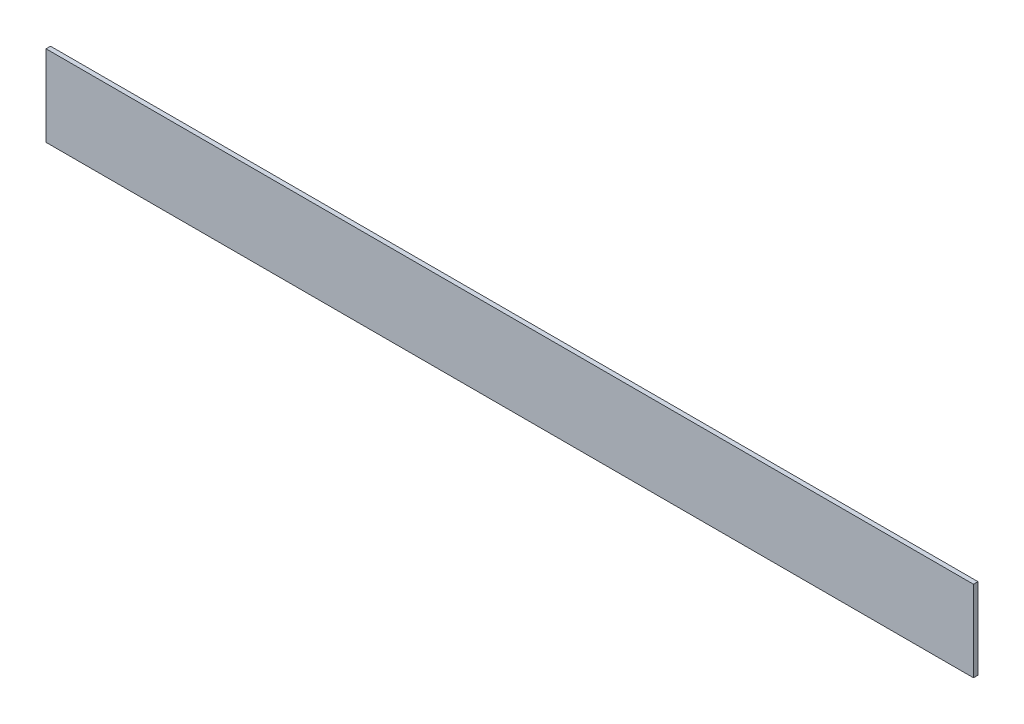
ISO-10303-21;
HEADER;
FILE_DESCRIPTION(('STEP AP214'),'2;1');
FILE_NAME('part.step','',(''),(''),'','','');
FILE_SCHEMA(('AUTOMOTIVE_DESIGN { 1 0 10303 214 1 1 1 1 }'));
ENDSEC;
DATA;
#1=APPLICATION_CONTEXT('core data for automotive mechanical design processes');
#2=APPLICATION_PROTOCOL_DEFINITION('international standard','automotive_design',2000,#1);
#3=PRODUCT_CONTEXT('',#1,'mechanical');
#4=PRODUCT('Part','Part','',(#3));
#5=PRODUCT_RELATED_PRODUCT_CATEGORY('part','',(#4));
#6=PRODUCT_DEFINITION_FORMATION('','',#4);
#7=PRODUCT_DEFINITION_CONTEXT('part definition',#1,'design');
#8=PRODUCT_DEFINITION('design','',#6,#7);
#9=PRODUCT_DEFINITION_SHAPE('','',#8);
#10=(LENGTH_UNIT() NAMED_UNIT(*) SI_UNIT(.MILLI.,.METRE.));
#11=(NAMED_UNIT(*) PLANE_ANGLE_UNIT() SI_UNIT($,.RADIAN.));
#12=(NAMED_UNIT(*) SI_UNIT($,.STERADIAN.) SOLID_ANGLE_UNIT());
#13=UNCERTAINTY_MEASURE_WITH_UNIT(LENGTH_MEASURE(1.E-05),#10,'distance_accuracy_value','');
#14=(GEOMETRIC_REPRESENTATION_CONTEXT(3) GLOBAL_UNCERTAINTY_ASSIGNED_CONTEXT((#13)) GLOBAL_UNIT_ASSIGNED_CONTEXT((#10,
#11,#12)) REPRESENTATION_CONTEXT('',''));
#15=CARTESIAN_POINT('',(0.,0.,0.));
#16=DIRECTION('',(0.,0.,1.));
#17=DIRECTION('',(1.,0.,0.));
#18=AXIS2_PLACEMENT_3D('',#15,#16,#17);
#19=CARTESIAN_POINT('',(-327.025,0.,3.175));
#20=DIRECTION('',(1.,0.,0.));
#21=DIRECTION('',(0.,0.,-1.));
#22=AXIS2_PLACEMENT_3D('',#19,#20,#21);
#23=PLANE('',#22);
#24=DIRECTION('',(0.,-1.,0.));
#25=VECTOR('',#24,1.);
#26=CARTESIAN_POINT('',(-327.025,0.,0.));
#27=LINE('',#26,#25);
#28=CARTESIAN_POINT('',(-327.025,57.15,0.));
#29=VERTEX_POINT('',#28);
#30=CARTESIAN_POINT('',(-327.025,0.,0.));
#31=VERTEX_POINT('',#30);
#32=EDGE_CURVE('E96',#29,#31,#27,.T.);
#33=ORIENTED_EDGE('',*,*,#32,.T.);
#34=DIRECTION('',(0.,0.,-1.));
#35=VECTOR('',#34,1.);
#36=CARTESIAN_POINT('',(-327.025,0.,3.175));
#37=LINE('',#36,#35);
#38=CARTESIAN_POINT('',(-327.025,0.,3.175));
#39=VERTEX_POINT('',#38);
#40=EDGE_CURVE('E11',#39,#31,#37,.T.);
#41=ORIENTED_EDGE('',*,*,#40,.F.);
#42=DIRECTION('',(0.,-1.,0.));
#43=VECTOR('',#42,1.);
#44=CARTESIAN_POINT('',(-327.025,0.,3.175));
#45=LINE('',#44,#43);
#46=CARTESIAN_POINT('',(-327.025,57.15,3.175));
#47=VERTEX_POINT('',#46);
#48=EDGE_CURVE('E84',#47,#39,#45,.T.);
#49=ORIENTED_EDGE('',*,*,#48,.F.);
#50=DIRECTION('',(0.,0.,-1.));
#51=VECTOR('',#50,1.);
#52=CARTESIAN_POINT('',(-327.025,57.15,3.175));
#53=LINE('',#52,#51);
#54=EDGE_CURVE('E92',#47,#29,#53,.T.);
#55=ORIENTED_EDGE('',*,*,#54,.T.);
#56=EDGE_LOOP('',(#33,#41,#49,#55));
#57=FACE_BOUND('',#56,.T.);
#58=ADVANCED_FACE('F33',(#57),#23,.F.);
#59=CARTESIAN_POINT('',(-327.025,0.,3.175));
#60=DIRECTION('',(0.,1.,0.));
#61=DIRECTION('',(0.,0.,1.));
#62=AXIS2_PLACEMENT_3D('',#59,#60,#61);
#63=PLANE('',#62);
#64=DIRECTION('',(1.,0.,0.));
#65=VECTOR('',#64,1.);
#66=CARTESIAN_POINT('',(-327.025,0.,0.));
#67=LINE('',#66,#65);
#68=CARTESIAN_POINT('',(327.025,0.,0.));
#69=VERTEX_POINT('',#68);
#70=EDGE_CURVE('E88',#31,#69,#67,.T.);
#71=ORIENTED_EDGE('',*,*,#70,.T.);
#72=DIRECTION('',(0.,0.,-1.));
#73=VECTOR('',#72,1.);
#74=CARTESIAN_POINT('',(327.025,0.,3.175));
#75=LINE('',#74,#73);
#76=CARTESIAN_POINT('',(327.025,0.,3.175));
#77=VERTEX_POINT('',#76);
#78=EDGE_CURVE('E41',#77,#69,#75,.T.);
#79=ORIENTED_EDGE('',*,*,#78,.F.);
#80=DIRECTION('',(1.,0.,0.));
#81=VECTOR('',#80,1.);
#82=CARTESIAN_POINT('',(-327.025,0.,3.175));
#83=LINE('',#82,#81);
#84=EDGE_CURVE('E79',#39,#77,#83,.T.);
#85=ORIENTED_EDGE('',*,*,#84,.F.);
#86=ORIENTED_EDGE('',*,*,#40,.T.);
#87=EDGE_LOOP('',(#71,#79,#85,#86));
#88=FACE_BOUND('',#87,.T.);
#89=ADVANCED_FACE('F87',(#88),#63,.F.);
#90=CARTESIAN_POINT('',(327.025,0.,3.175));
#91=DIRECTION('',(-1.,0.,0.));
#92=DIRECTION('',(0.,0.,1.));
#93=AXIS2_PLACEMENT_3D('',#90,#91,#92);
#94=PLANE('',#93);
#95=DIRECTION('',(0.,1.,0.));
#96=VECTOR('',#95,1.);
#97=CARTESIAN_POINT('',(327.025,0.,0.));
#98=LINE('',#97,#96);
#99=CARTESIAN_POINT('',(327.025,57.15,0.));
#100=VERTEX_POINT('',#99);
#101=EDGE_CURVE('E66',#69,#100,#98,.T.);
#102=ORIENTED_EDGE('',*,*,#101,.T.);
#103=DIRECTION('',(0.,0.,-1.));
#104=VECTOR('',#103,1.);
#105=CARTESIAN_POINT('',(327.025,57.15,3.175));
#106=LINE('',#105,#104);
#107=CARTESIAN_POINT('',(327.025,57.15,3.175));
#108=VERTEX_POINT('',#107);
#109=EDGE_CURVE('E89',#108,#100,#106,.T.);
#110=ORIENTED_EDGE('',*,*,#109,.F.);
#111=DIRECTION('',(0.,1.,0.));
#112=VECTOR('',#111,1.);
#113=CARTESIAN_POINT('',(327.025,0.,3.175));
#114=LINE('',#113,#112);
#115=EDGE_CURVE('E82',#77,#108,#114,.T.);
#116=ORIENTED_EDGE('',*,*,#115,.F.);
#117=ORIENTED_EDGE('',*,*,#78,.T.);
#118=EDGE_LOOP('',(#102,#110,#116,#117));
#119=FACE_BOUND('',#118,.T.);
#120=ADVANCED_FACE('F90',(#119),#94,.F.);
#121=CARTESIAN_POINT('',(-327.025,57.15,3.175));
#122=DIRECTION('',(0.,-1.,0.));
#123=DIRECTION('',(0.,0.,-1.));
#124=AXIS2_PLACEMENT_3D('',#121,#122,#123);
#125=PLANE('',#124);
#126=DIRECTION('',(-1.,0.,0.));
#127=VECTOR('',#126,1.);
#128=CARTESIAN_POINT('',(-327.025,57.15,0.));
#129=LINE('',#128,#127);
#130=EDGE_CURVE('E72',#100,#29,#129,.T.);
#131=ORIENTED_EDGE('',*,*,#130,.T.);
#132=ORIENTED_EDGE('',*,*,#54,.F.);
#133=DIRECTION('',(-1.,0.,0.));
#134=VECTOR('',#133,1.);
#135=CARTESIAN_POINT('',(-327.025,57.15,3.175));
#136=LINE('',#135,#134);
#137=EDGE_CURVE('E49',#108,#47,#136,.T.);
#138=ORIENTED_EDGE('',*,*,#137,.F.);
#139=ORIENTED_EDGE('',*,*,#109,.T.);
#140=EDGE_LOOP('',(#131,#132,#138,#139));
#141=FACE_BOUND('',#140,.T.);
#142=ADVANCED_FACE('F103',(#141),#125,.F.);
#143=CARTESIAN_POINT('',(0.,0.,3.175));
#144=DIRECTION('',(0.,0.,-1.));
#145=DIRECTION('',(-1.,0.,0.));
#146=AXIS2_PLACEMENT_3D('',#143,#144,#145);
#147=PLANE('',#146);
#148=ORIENTED_EDGE('',*,*,#48,.T.);
#149=ORIENTED_EDGE('',*,*,#84,.T.);
#150=ORIENTED_EDGE('',*,*,#115,.T.);
#151=ORIENTED_EDGE('',*,*,#137,.T.);
#152=EDGE_LOOP('',(#148,#149,#150,#151));
#153=FACE_BOUND('',#152,.T.);
#154=ADVANCED_FACE('F80',(#153),#147,.F.);
#155=CARTESIAN_POINT('',(0.,0.,0.));
#156=DIRECTION('',(0.,0.,-1.));
#157=DIRECTION('',(-1.,0.,0.));
#158=AXIS2_PLACEMENT_3D('',#155,#156,#157);
#159=PLANE('',#158);
#160=ORIENTED_EDGE('',*,*,#32,.F.);
#161=ORIENTED_EDGE('',*,*,#130,.F.);
#162=ORIENTED_EDGE('',*,*,#101,.F.);
#163=ORIENTED_EDGE('',*,*,#70,.F.);
#164=EDGE_LOOP('',(#160,#161,#162,#163));
#165=FACE_BOUND('',#164,.T.);
#166=ADVANCED_FACE('F106',(#165),#159,.T.);
#167=CLOSED_SHELL('',(#58,#89,#120,#142,#154,#166));
#168=MANIFOLD_SOLID_BREP('B2',#167);
#169=ADVANCED_BREP_SHAPE_REPRESENTATION('',(#18,#168),#14);
#170=SHAPE_DEFINITION_REPRESENTATION(#9,#169);
ENDSEC;
END-ISO-10303-21;
